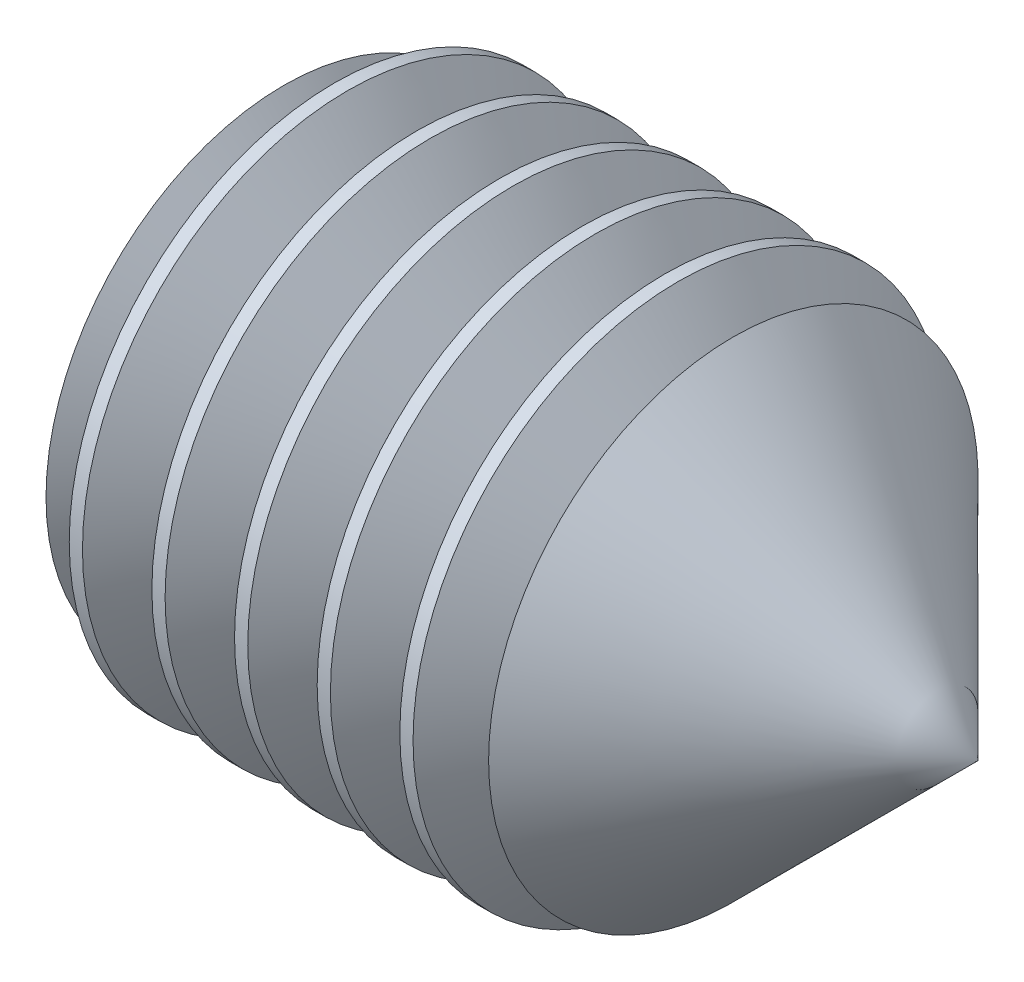
ISO-10303-21;
HEADER;
FILE_DESCRIPTION(('STEP AP214'),'2;1');
FILE_NAME('part.step','',(''),(''),'','','');
FILE_SCHEMA(('AUTOMOTIVE_DESIGN { 1 0 10303 214 1 1 1 1 }'));
ENDSEC;
DATA;
#1=APPLICATION_CONTEXT('core data for automotive mechanical design processes');
#2=APPLICATION_PROTOCOL_DEFINITION('international standard','automotive_design',2000,#1);
#3=PRODUCT_CONTEXT('',#1,'mechanical');
#4=PRODUCT('Part','Part','',(#3));
#5=PRODUCT_RELATED_PRODUCT_CATEGORY('part','',(#4));
#6=PRODUCT_DEFINITION_FORMATION('','',#4);
#7=PRODUCT_DEFINITION_CONTEXT('part definition',#1,'design');
#8=PRODUCT_DEFINITION('design','',#6,#7);
#9=PRODUCT_DEFINITION_SHAPE('','',#8);
#10=(LENGTH_UNIT() NAMED_UNIT(*) SI_UNIT(.MILLI.,.METRE.));
#11=(NAMED_UNIT(*) PLANE_ANGLE_UNIT() SI_UNIT($,.RADIAN.));
#12=(NAMED_UNIT(*) SI_UNIT($,.STERADIAN.) SOLID_ANGLE_UNIT());
#13=UNCERTAINTY_MEASURE_WITH_UNIT(LENGTH_MEASURE(1.E-05),#10,'distance_accuracy_value','');
#14=(GEOMETRIC_REPRESENTATION_CONTEXT(3) GLOBAL_UNCERTAINTY_ASSIGNED_CONTEXT((#13)) GLOBAL_UNIT_ASSIGNED_CONTEXT((#10,
#11,#12)) REPRESENTATION_CONTEXT('',''));
#15=CARTESIAN_POINT('',(0.,0.,0.));
#16=DIRECTION('',(0.,0.,1.));
#17=DIRECTION('',(1.,0.,0.));
#18=AXIS2_PLACEMENT_3D('',#15,#16,#17);
#19=CARTESIAN_POINT('',(0.,0.,0.));
#20=DIRECTION('',(-1.,0.,0.));
#21=DIRECTION('',(0.,0.,1.));
#22=AXIS2_PLACEMENT_3D('',#19,#20,#21);
#23=PLANE('',#22);
#24=CARTESIAN_POINT('',(0.,0.,0.));
#25=DIRECTION('',(-1.,0.,0.));
#26=DIRECTION('',(0.,0.,1.));
#27=AXIS2_PLACEMENT_3D('',#24,#25,#26);
#28=CIRCLE('',#27,1.2195);
#29=CARTESIAN_POINT('',(0.,0.,1.2195));
#30=VERTEX_POINT('',#29);
#31=EDGE_CURVE('E11',#30,#30,#28,.T.);
#32=ORIENTED_EDGE('',*,*,#31,.T.);
#33=EDGE_LOOP('',(#32));
#34=FACE_BOUND('',#33,.T.);
#35=DIRECTION('',(0.,0.,-1.));
#36=VECTOR('',#35,1.);
#37=CARTESIAN_POINT('',(0.,0.750000000000003,0.433012701892216));
#38=LINE('',#37,#36);
#39=CARTESIAN_POINT('',(0.,0.750000000000003,0.433012701892216));
#40=VERTEX_POINT('',#39);
#41=CARTESIAN_POINT('',(0.,0.750000000000003,-0.433012701892223));
#42=VERTEX_POINT('',#41);
#43=EDGE_CURVE('E100',#40,#42,#38,.T.);
#44=ORIENTED_EDGE('',*,*,#43,.F.);
#45=DIRECTION('',(0.,-0.866025403784438,0.500000000000001));
#46=VECTOR('',#45,1.);
#47=CARTESIAN_POINT('',(0.,0.750000000000003,0.433012701892216));
#48=LINE('',#47,#46);
#49=CARTESIAN_POINT('',(0.,0.,0.866025403784436));
#50=VERTEX_POINT('',#49);
#51=EDGE_CURVE('E54',#40,#50,#48,.T.);
#52=ORIENTED_EDGE('',*,*,#51,.T.);
#53=DIRECTION('',(0.,0.866025403784439,0.5));
#54=VECTOR('',#53,1.);
#55=CARTESIAN_POINT('',(0.,-0.749999999999996,0.433012701892216));
#56=LINE('',#55,#54);
#57=CARTESIAN_POINT('',(0.,-0.749999999999996,0.433012701892216));
#58=VERTEX_POINT('',#57);
#59=EDGE_CURVE('E106',#58,#50,#56,.T.);
#60=ORIENTED_EDGE('',*,*,#59,.F.);
#61=DIRECTION('',(0.,0.,-1.));
#62=VECTOR('',#61,1.);
#63=CARTESIAN_POINT('',(0.,-0.749999999999996,0.433012701892216));
#64=LINE('',#63,#62);
#65=CARTESIAN_POINT('',(0.,-0.749999999999996,-0.433012701892222));
#66=VERTEX_POINT('',#65);
#67=EDGE_CURVE('E127',#58,#66,#64,.T.);
#68=ORIENTED_EDGE('',*,*,#67,.T.);
#69=DIRECTION('',(0.,0.866025403784438,-0.500000000000001));
#70=VECTOR('',#69,1.);
#71=CARTESIAN_POINT('',(0.,-0.749999999999996,-0.433012701892222));
#72=LINE('',#71,#70);
#73=CARTESIAN_POINT('',(0.,0.,-0.866025403784442));
#74=VERTEX_POINT('',#73);
#75=EDGE_CURVE('E130',#66,#74,#72,.T.);
#76=ORIENTED_EDGE('',*,*,#75,.T.);
#77=DIRECTION('',(0.,-0.866025403784439,-0.5));
#78=VECTOR('',#77,1.);
#79=CARTESIAN_POINT('',(0.,0.750000000000003,-0.433012701892223));
#80=LINE('',#79,#78);
#81=EDGE_CURVE('E133',#42,#74,#80,.T.);
#82=ORIENTED_EDGE('',*,*,#81,.F.);
#83=EDGE_LOOP('',(#44,#52,#60,#68,#76,#82));
#84=FACE_BOUND('',#83,.T.);
#85=ADVANCED_FACE('F38',(#34,#84),#23,.T.);
#86=CARTESIAN_POINT('',(0.,0.,0.));
#87=DIRECTION('',(1.,0.,0.));
#88=DIRECTION('',(0.,0.,-1.));
#89=AXIS2_PLACEMENT_3D('',#86,#87,#88);
#90=CONICAL_SURFACE('',#89,1.2195,1.0471975511966);
#91=CARTESIAN_POINT('',(0.0731865121550404,0.,0.));
#92=DIRECTION('',(-1.,0.,0.));
#93=DIRECTION('',(0.,-1.,0.));
#94=AXIS2_PLACEMENT_3D('',#91,#92,#93);
#95=CIRCLE('',#94,1.34626275748129);
#96=CARTESIAN_POINT('',(0.0731865121550406,-1.34626275748129,0.));
#97=VERTEX_POINT('',#96);
#98=EDGE_CURVE('E125',#97,#97,#95,.F.);
#99=ORIENTED_EDGE('',*,*,#98,.F.);
#100=EDGE_LOOP('',(#99));
#101=FACE_BOUND('',#100,.T.);
#102=ORIENTED_EDGE('',*,*,#31,.F.);
#103=EDGE_LOOP('',(#102));
#104=FACE_BOUND('',#103,.T.);
#105=ADVANCED_FACE('F221',(#101,#104),#90,.T.);
#106=CARTESIAN_POINT('',(2.,0.750000000000003,0.433012701892216));
#107=DIRECTION('',(0.,-0.500000000000001,-0.866025403784438));
#108=DIRECTION('',(0.,0.866025403784438,-0.500000000000001));
#109=AXIS2_PLACEMENT_3D('',#106,#107,#108);
#110=PLANE('',#109);
#111=ORIENTED_EDGE('',*,*,#51,.F.);
#112=DIRECTION('',(-1.,0.,0.));
#113=VECTOR('',#112,1.);
#114=CARTESIAN_POINT('',(2.,0.750000000000003,0.433012701892216));
#115=LINE('',#114,#113);
#116=CARTESIAN_POINT('',(2.,0.750000000000003,0.433012701892216));
#117=VERTEX_POINT('',#116);
#118=EDGE_CURVE('E94',#117,#40,#115,.T.);
#119=ORIENTED_EDGE('',*,*,#118,.F.);
#120=DIRECTION('',(0.,-0.866025403784438,0.500000000000001));
#121=VECTOR('',#120,1.);
#122=CARTESIAN_POINT('',(2.,0.750000000000003,0.433012701892216));
#123=LINE('',#122,#121);
#124=CARTESIAN_POINT('',(2.,0.,0.866025403784436));
#125=VERTEX_POINT('',#124);
#126=EDGE_CURVE('E90',#117,#125,#123,.T.);
#127=ORIENTED_EDGE('',*,*,#126,.T.);
#128=DIRECTION('',(-1.,0.,0.));
#129=VECTOR('',#128,1.);
#130=CARTESIAN_POINT('',(2.,0.,0.866025403784436));
#131=LINE('',#130,#129);
#132=EDGE_CURVE('E46',#125,#50,#131,.T.);
#133=ORIENTED_EDGE('',*,*,#132,.T.);
#134=EDGE_LOOP('',(#111,#119,#127,#133));
#135=FACE_BOUND('',#134,.T.);
#136=ADVANCED_FACE('F92',(#135),#110,.T.);
#137=CARTESIAN_POINT('',(2.,-0.749999999999996,0.433012701892216));
#138=DIRECTION('',(0.,-0.5,0.866025403784439));
#139=DIRECTION('',(0.,-0.866025403784439,-0.5));
#140=AXIS2_PLACEMENT_3D('',#137,#138,#139);
#141=PLANE('',#140);
#142=ORIENTED_EDGE('',*,*,#59,.T.);
#143=ORIENTED_EDGE('',*,*,#132,.F.);
#144=DIRECTION('',(0.,0.866025403784439,0.5));
#145=VECTOR('',#144,1.);
#146=CARTESIAN_POINT('',(2.,-0.749999999999996,0.433012701892216));
#147=LINE('',#146,#145);
#148=CARTESIAN_POINT('',(2.,-0.749999999999996,0.433012701892216));
#149=VERTEX_POINT('',#148);
#150=EDGE_CURVE('E99',#149,#125,#147,.T.);
#151=ORIENTED_EDGE('',*,*,#150,.F.);
#152=DIRECTION('',(-1.,0.,0.));
#153=VECTOR('',#152,1.);
#154=CARTESIAN_POINT('',(2.,-0.749999999999996,0.433012701892216));
#155=LINE('',#154,#153);
#156=EDGE_CURVE('E107',#149,#58,#155,.T.);
#157=ORIENTED_EDGE('',*,*,#156,.T.);
#158=EDGE_LOOP('',(#142,#143,#151,#157));
#159=FACE_BOUND('',#158,.T.);
#160=ADVANCED_FACE('F104',(#159),#141,.F.);
#161=CARTESIAN_POINT('',(2.,-0.749999999999996,0.433012701892216));
#162=DIRECTION('',(0.,1.,0.));
#163=DIRECTION('',(0.,0.,1.));
#164=AXIS2_PLACEMENT_3D('',#161,#162,#163);
#165=PLANE('',#164);
#166=ORIENTED_EDGE('',*,*,#67,.F.);
#167=ORIENTED_EDGE('',*,*,#156,.F.);
#168=DIRECTION('',(0.,0.,-1.));
#169=VECTOR('',#168,1.);
#170=CARTESIAN_POINT('',(2.,-0.749999999999996,0.433012701892216));
#171=LINE('',#170,#169);
#172=CARTESIAN_POINT('',(2.,-0.749999999999996,-0.433012701892222));
#173=VERTEX_POINT('',#172);
#174=EDGE_CURVE('E112',#149,#173,#171,.T.);
#175=ORIENTED_EDGE('',*,*,#174,.T.);
#176=DIRECTION('',(-1.,0.,0.));
#177=VECTOR('',#176,1.);
#178=CARTESIAN_POINT('',(2.,-0.749999999999996,-0.433012701892222));
#179=LINE('',#178,#177);
#180=EDGE_CURVE('E143',#173,#66,#179,.T.);
#181=ORIENTED_EDGE('',*,*,#180,.T.);
#182=EDGE_LOOP('',(#166,#167,#175,#181));
#183=FACE_BOUND('',#182,.T.);
#184=ADVANCED_FACE('F243',(#183),#165,.T.);
#185=CARTESIAN_POINT('',(2.,-0.749999999999996,-0.433012701892222));
#186=DIRECTION('',(0.,0.500000000000001,0.866025403784438));
#187=DIRECTION('',(0.,-0.866025403784438,0.500000000000001));
#188=AXIS2_PLACEMENT_3D('',#185,#186,#187);
#189=PLANE('',#188);
#190=ORIENTED_EDGE('',*,*,#75,.F.);
#191=ORIENTED_EDGE('',*,*,#180,.F.);
#192=DIRECTION('',(0.,0.866025403784438,-0.500000000000001));
#193=VECTOR('',#192,1.);
#194=CARTESIAN_POINT('',(2.,-0.749999999999996,-0.433012701892222));
#195=LINE('',#194,#193);
#196=CARTESIAN_POINT('',(2.,0.,-0.866025403784442));
#197=VERTEX_POINT('',#196);
#198=EDGE_CURVE('E114',#173,#197,#195,.T.);
#199=ORIENTED_EDGE('',*,*,#198,.T.);
#200=DIRECTION('',(-1.,0.,0.));
#201=VECTOR('',#200,1.);
#202=CARTESIAN_POINT('',(2.,0.,-0.866025403784442));
#203=LINE('',#202,#201);
#204=EDGE_CURVE('E141',#197,#74,#203,.T.);
#205=ORIENTED_EDGE('',*,*,#204,.T.);
#206=EDGE_LOOP('',(#190,#191,#199,#205));
#207=FACE_BOUND('',#206,.T.);
#208=ADVANCED_FACE('F239',(#207),#189,.T.);
#209=CARTESIAN_POINT('',(2.,0.750000000000003,-0.433012701892223));
#210=DIRECTION('',(0.,0.5,-0.866025403784439));
#211=DIRECTION('',(0.,0.866025403784439,0.5));
#212=AXIS2_PLACEMENT_3D('',#209,#210,#211);
#213=PLANE('',#212);
#214=ORIENTED_EDGE('',*,*,#81,.T.);
#215=ORIENTED_EDGE('',*,*,#204,.F.);
#216=DIRECTION('',(0.,-0.866025403784439,-0.5));
#217=VECTOR('',#216,1.);
#218=CARTESIAN_POINT('',(2.,0.750000000000003,-0.433012701892223));
#219=LINE('',#218,#217);
#220=CARTESIAN_POINT('',(2.,0.750000000000003,-0.433012701892223));
#221=VERTEX_POINT('',#220);
#222=EDGE_CURVE('E119',#221,#197,#219,.T.);
#223=ORIENTED_EDGE('',*,*,#222,.F.);
#224=DIRECTION('',(-1.,0.,0.));
#225=VECTOR('',#224,1.);
#226=CARTESIAN_POINT('',(2.,0.750000000000003,-0.433012701892223));
#227=LINE('',#226,#225);
#228=EDGE_CURVE('E139',#221,#42,#227,.T.);
#229=ORIENTED_EDGE('',*,*,#228,.T.);
#230=EDGE_LOOP('',(#214,#215,#223,#229));
#231=FACE_BOUND('',#230,.T.);
#232=ADVANCED_FACE('F236',(#231),#213,.F.);
#233=CARTESIAN_POINT('',(2.,0.750000000000003,0.433012701892216));
#234=DIRECTION('',(0.,1.,0.));
#235=DIRECTION('',(0.,0.,1.));
#236=AXIS2_PLACEMENT_3D('',#233,#234,#235);
#237=PLANE('',#236);
#238=ORIENTED_EDGE('',*,*,#43,.T.);
#239=ORIENTED_EDGE('',*,*,#228,.F.);
#240=DIRECTION('',(0.,0.,-1.));
#241=VECTOR('',#240,1.);
#242=CARTESIAN_POINT('',(2.,0.750000000000003,0.433012701892216));
#243=LINE('',#242,#241);
#244=EDGE_CURVE('E122',#117,#221,#243,.T.);
#245=ORIENTED_EDGE('',*,*,#244,.F.);
#246=ORIENTED_EDGE('',*,*,#118,.T.);
#247=EDGE_LOOP('',(#238,#239,#245,#246));
#248=FACE_BOUND('',#247,.T.);
#249=ADVANCED_FACE('F232',(#248),#237,.F.);
#250=CARTESIAN_POINT('',(2.,1.5,0.));
#251=DIRECTION('',(1.,0.,0.));
#252=DIRECTION('',(0.,0.,-1.));
#253=AXIS2_PLACEMENT_3D('',#250,#251,#252);
#254=PLANE('',#253);
#255=ORIENTED_EDGE('',*,*,#126,.F.);
#256=ORIENTED_EDGE('',*,*,#244,.T.);
#257=ORIENTED_EDGE('',*,*,#222,.T.);
#258=ORIENTED_EDGE('',*,*,#198,.F.);
#259=ORIENTED_EDGE('',*,*,#174,.F.);
#260=ORIENTED_EDGE('',*,*,#150,.T.);
#261=EDGE_LOOP('',(#255,#256,#257,#258,#259,#260));
#262=FACE_BOUND('',#261,.T.);
#263=ADVANCED_FACE('F110',(#262),#254,.F.);
#264=CARTESIAN_POINT('',(0.358354964975511,0.,0.));
#265=DIRECTION('',(1.,0.,0.));
#266=DIRECTION('',(0.,1.,0.));
#267=AXIS2_PLACEMENT_3D('',#264,#265,#266);
#268=CONICAL_SURFACE('',#267,1.5,0.959931088596883);
#269=CARTESIAN_POINT('',(0.161946750507689,0.,0.));
#270=DIRECTION('',(-1.,0.,0.));
#271=DIRECTION('',(0.,-1.,0.));
#272=AXIS2_PLACEMENT_3D('',#269,#270,#271);
#273=CIRCLE('',#272,1.2195);
#274=CARTESIAN_POINT('',(0.161946750507689,-1.2195,0.));
#275=VERTEX_POINT('',#274);
#276=EDGE_CURVE('E150',#275,#275,#273,.T.);
#277=ORIENTED_EDGE('',*,*,#276,.F.);
#278=EDGE_LOOP('',(#277));
#279=FACE_BOUND('',#278,.T.);
#280=CARTESIAN_POINT('',(0.358354964975511,0.,0.));
#281=DIRECTION('',(-1.,0.,0.));
#282=DIRECTION('',(0.,-1.,0.));
#283=AXIS2_PLACEMENT_3D('',#280,#281,#282);
#284=CIRCLE('',#283,1.5);
#285=CARTESIAN_POINT('',(0.358354964975512,-1.5,0.));
#286=VERTEX_POINT('',#285);
#287=EDGE_CURVE('E146',#286,#286,#284,.T.);
#288=ORIENTED_EDGE('',*,*,#287,.T.);
#289=EDGE_LOOP('',(#288));
#290=FACE_BOUND('',#289,.T.);
#291=ADVANCED_FACE('F270',(#279,#290),#268,.T.);
#292=CARTESIAN_POINT('',(0.161946750507689,0.,0.));
#293=DIRECTION('',(-1.,0.,0.));
#294=DIRECTION('',(0.,-1.,0.));
#295=AXIS2_PLACEMENT_3D('',#292,#293,#294);
#296=CONICAL_SURFACE('',#295,1.2195,0.959931088596876);
#297=ORIENTED_EDGE('',*,*,#98,.T.);
#298=EDGE_LOOP('',(#297));
#299=FACE_BOUND('',#298,.T.);
#300=ORIENTED_EDGE('',*,*,#276,.T.);
#301=EDGE_LOOP('',(#300));
#302=FACE_BOUND('',#301,.T.);
#303=ADVANCED_FACE('F260',(#299,#302),#296,.T.);
#304=CARTESIAN_POINT('',(-12.7,0.,0.));
#305=DIRECTION('',(-1.,0.,0.));
#306=DIRECTION('',(0.,0.,1.));
#307=AXIS2_PLACEMENT_3D('',#304,#305,#306);
#308=CYLINDRICAL_SURFACE('',#307,1.5);
#309=CARTESIAN_POINT('',(0.433149376590281,0.,0.));
#310=DIRECTION('',(-1.,0.,0.));
#311=DIRECTION('',(0.,-1.,0.));
#312=AXIS2_PLACEMENT_3D('',#309,#310,#311);
#313=CIRCLE('',#312,1.5);
#314=CARTESIAN_POINT('',(0.433149376590282,-1.5,0.));
#315=VERTEX_POINT('',#314);
#316=EDGE_CURVE('E159',#315,#315,#313,.T.);
#317=ORIENTED_EDGE('',*,*,#316,.T.);
#318=EDGE_LOOP('',(#317));
#319=FACE_BOUND('',#318,.T.);
#320=ORIENTED_EDGE('',*,*,#287,.F.);
#321=EDGE_LOOP('',(#320));
#322=FACE_BOUND('',#321,.T.);
#323=ADVANCED_FACE('F217',(#319,#322),#308,.T.);
#324=CARTESIAN_POINT('',(0.82596580552593,0.,0.));
#325=DIRECTION('',(1.,0.,0.));
#326=DIRECTION('',(0.,1.,0.));
#327=AXIS2_PLACEMENT_3D('',#324,#325,#326);
#328=CONICAL_SURFACE('',#327,1.5,0.959931088596883);
#329=CARTESIAN_POINT('',(0.629557591058107,0.,0.));
#330=DIRECTION('',(-1.,0.,0.));
#331=DIRECTION('',(0.,-1.,0.));
#332=AXIS2_PLACEMENT_3D('',#329,#330,#331);
#333=CIRCLE('',#332,1.2195);
#334=CARTESIAN_POINT('',(0.629557591058107,-1.2195,0.));
#335=VERTEX_POINT('',#334);
#336=EDGE_CURVE('E162',#335,#335,#333,.T.);
#337=ORIENTED_EDGE('',*,*,#336,.F.);
#338=EDGE_LOOP('',(#337));
#339=FACE_BOUND('',#338,.T.);
#340=CARTESIAN_POINT('',(0.82596580552593,0.,0.));
#341=DIRECTION('',(-1.,0.,0.));
#342=DIRECTION('',(0.,-1.,0.));
#343=AXIS2_PLACEMENT_3D('',#340,#341,#342);
#344=CIRCLE('',#343,1.5);
#345=CARTESIAN_POINT('',(0.82596580552593,-1.5,0.));
#346=VERTEX_POINT('',#345);
#347=EDGE_CURVE('E154',#346,#346,#344,.T.);
#348=ORIENTED_EDGE('',*,*,#347,.T.);
#349=EDGE_LOOP('',(#348));
#350=FACE_BOUND('',#349,.T.);
#351=ADVANCED_FACE('F259',(#339,#350),#328,.T.);
#352=CARTESIAN_POINT('',(0.629557591058107,0.,0.));
#353=DIRECTION('',(-1.,0.,0.));
#354=DIRECTION('',(0.,-1.,0.));
#355=AXIS2_PLACEMENT_3D('',#352,#353,#354);
#356=CONICAL_SURFACE('',#355,1.2195,0.959931088596876);
#357=ORIENTED_EDGE('',*,*,#316,.F.);
#358=EDGE_LOOP('',(#357));
#359=FACE_BOUND('',#358,.T.);
#360=ORIENTED_EDGE('',*,*,#336,.T.);
#361=EDGE_LOOP('',(#360));
#362=FACE_BOUND('',#361,.T.);
#363=ADVANCED_FACE('F267',(#359,#362),#356,.T.);
#364=CARTESIAN_POINT('',(0.9007602171407,0.,0.));
#365=DIRECTION('',(-1.,0.,0.));
#366=DIRECTION('',(0.,-1.,0.));
#367=AXIS2_PLACEMENT_3D('',#364,#365,#366);
#368=CIRCLE('',#367,1.5);
#369=CARTESIAN_POINT('',(0.9007602171407,-1.5,0.));
#370=VERTEX_POINT('',#369);
#371=EDGE_CURVE('E168',#370,#370,#368,.T.);
#372=ORIENTED_EDGE('',*,*,#371,.T.);
#373=EDGE_LOOP('',(#372));
#374=FACE_BOUND('',#373,.T.);
#375=ORIENTED_EDGE('',*,*,#347,.F.);
#376=EDGE_LOOP('',(#375));
#377=FACE_BOUND('',#376,.T.);
#378=ADVANCED_FACE('F262',(#374,#377),#308,.T.);
#379=CARTESIAN_POINT('',(1.29357664607635,0.,0.));
#380=DIRECTION('',(1.,0.,0.));
#381=DIRECTION('',(0.,1.,0.));
#382=AXIS2_PLACEMENT_3D('',#379,#380,#381);
#383=CONICAL_SURFACE('',#382,1.5,0.959931088596883);
#384=CARTESIAN_POINT('',(1.09716843160853,0.,0.));
#385=DIRECTION('',(-1.,0.,0.));
#386=DIRECTION('',(0.,-1.,0.));
#387=AXIS2_PLACEMENT_3D('',#384,#385,#386);
#388=CIRCLE('',#387,1.2195);
#389=CARTESIAN_POINT('',(1.09716843160853,-1.2195,0.));
#390=VERTEX_POINT('',#389);
#391=EDGE_CURVE('E171',#390,#390,#388,.T.);
#392=ORIENTED_EDGE('',*,*,#391,.F.);
#393=EDGE_LOOP('',(#392));
#394=FACE_BOUND('',#393,.T.);
#395=CARTESIAN_POINT('',(1.29357664607635,0.,0.));
#396=DIRECTION('',(-1.,0.,0.));
#397=DIRECTION('',(0.,-1.,0.));
#398=AXIS2_PLACEMENT_3D('',#395,#396,#397);
#399=CIRCLE('',#398,1.5);
#400=CARTESIAN_POINT('',(1.29357664607635,-1.5,0.));
#401=VERTEX_POINT('',#400);
#402=EDGE_CURVE('E165',#401,#401,#399,.T.);
#403=ORIENTED_EDGE('',*,*,#402,.T.);
#404=EDGE_LOOP('',(#403));
#405=FACE_BOUND('',#404,.T.);
#406=ADVANCED_FACE('F274',(#394,#405),#383,.T.);
#407=CARTESIAN_POINT('',(1.09716843160853,0.,0.));
#408=DIRECTION('',(-1.,0.,0.));
#409=DIRECTION('',(0.,-1.,0.));
#410=AXIS2_PLACEMENT_3D('',#407,#408,#409);
#411=CONICAL_SURFACE('',#410,1.2195,0.959931088596876);
#412=ORIENTED_EDGE('',*,*,#371,.F.);
#413=EDGE_LOOP('',(#412));
#414=FACE_BOUND('',#413,.T.);
#415=ORIENTED_EDGE('',*,*,#391,.T.);
#416=EDGE_LOOP('',(#415));
#417=FACE_BOUND('',#416,.T.);
#418=ADVANCED_FACE('F281',(#414,#417),#411,.T.);
#419=CARTESIAN_POINT('',(1.36837105769112,0.,0.));
#420=DIRECTION('',(-1.,0.,0.));
#421=DIRECTION('',(0.,-1.,0.));
#422=AXIS2_PLACEMENT_3D('',#419,#420,#421);
#423=CIRCLE('',#422,1.5);
#424=CARTESIAN_POINT('',(1.36837105769112,-1.5,0.));
#425=VERTEX_POINT('',#424);
#426=EDGE_CURVE('E177',#425,#425,#423,.T.);
#427=ORIENTED_EDGE('',*,*,#426,.T.);
#428=EDGE_LOOP('',(#427));
#429=FACE_BOUND('',#428,.T.);
#430=ORIENTED_EDGE('',*,*,#402,.F.);
#431=EDGE_LOOP('',(#430));
#432=FACE_BOUND('',#431,.T.);
#433=ADVANCED_FACE('F276',(#429,#432),#308,.T.);
#434=CARTESIAN_POINT('',(1.76118748662677,0.,0.));
#435=DIRECTION('',(1.,0.,0.));
#436=DIRECTION('',(0.,1.,0.));
#437=AXIS2_PLACEMENT_3D('',#434,#435,#436);
#438=CONICAL_SURFACE('',#437,1.5,0.959931088596883);
#439=CARTESIAN_POINT('',(1.56477927215894,0.,0.));
#440=DIRECTION('',(-1.,0.,0.));
#441=DIRECTION('',(0.,-1.,0.));
#442=AXIS2_PLACEMENT_3D('',#439,#440,#441);
#443=CIRCLE('',#442,1.2195);
#444=CARTESIAN_POINT('',(1.56477927215894,-1.2195,0.));
#445=VERTEX_POINT('',#444);
#446=EDGE_CURVE('E180',#445,#445,#443,.T.);
#447=ORIENTED_EDGE('',*,*,#446,.F.);
#448=EDGE_LOOP('',(#447));
#449=FACE_BOUND('',#448,.T.);
#450=CARTESIAN_POINT('',(1.76118748662677,0.,0.));
#451=DIRECTION('',(-1.,0.,0.));
#452=DIRECTION('',(0.,-1.,0.));
#453=AXIS2_PLACEMENT_3D('',#450,#451,#452);
#454=CIRCLE('',#453,1.5);
#455=CARTESIAN_POINT('',(1.76118748662677,-1.5,0.));
#456=VERTEX_POINT('',#455);
#457=EDGE_CURVE('E174',#456,#456,#454,.T.);
#458=ORIENTED_EDGE('',*,*,#457,.T.);
#459=EDGE_LOOP('',(#458));
#460=FACE_BOUND('',#459,.T.);
#461=ADVANCED_FACE('F288',(#449,#460),#438,.T.);
#462=CARTESIAN_POINT('',(1.56477927215894,0.,0.));
#463=DIRECTION('',(-1.,0.,0.));
#464=DIRECTION('',(0.,-1.,0.));
#465=AXIS2_PLACEMENT_3D('',#462,#463,#464);
#466=CONICAL_SURFACE('',#465,1.2195,0.959931088596876);
#467=ORIENTED_EDGE('',*,*,#426,.F.);
#468=EDGE_LOOP('',(#467));
#469=FACE_BOUND('',#468,.T.);
#470=ORIENTED_EDGE('',*,*,#446,.T.);
#471=EDGE_LOOP('',(#470));
#472=FACE_BOUND('',#471,.T.);
#473=ADVANCED_FACE('F294',(#469,#472),#466,.T.);
#474=CARTESIAN_POINT('',(1.83598189824154,0.,0.));
#475=DIRECTION('',(-1.,0.,0.));
#476=DIRECTION('',(0.,-1.,0.));
#477=AXIS2_PLACEMENT_3D('',#474,#475,#476);
#478=CIRCLE('',#477,1.5);
#479=CARTESIAN_POINT('',(1.83598189824154,-1.5,0.));
#480=VERTEX_POINT('',#479);
#481=EDGE_CURVE('E186',#480,#480,#478,.T.);
#482=ORIENTED_EDGE('',*,*,#481,.T.);
#483=EDGE_LOOP('',(#482));
#484=FACE_BOUND('',#483,.T.);
#485=ORIENTED_EDGE('',*,*,#457,.F.);
#486=EDGE_LOOP('',(#485));
#487=FACE_BOUND('',#486,.T.);
#488=ADVANCED_FACE('F216',(#484,#487),#308,.T.);
#489=CARTESIAN_POINT('',(2.22879832717719,0.,0.));
#490=DIRECTION('',(1.,0.,0.));
#491=DIRECTION('',(0.,1.,0.));
#492=AXIS2_PLACEMENT_3D('',#489,#490,#491);
#493=CONICAL_SURFACE('',#492,1.5,0.959931088596883);
#494=CARTESIAN_POINT('',(2.03239011270936,0.,0.));
#495=DIRECTION('',(-1.,0.,0.));
#496=DIRECTION('',(0.,-1.,0.));
#497=AXIS2_PLACEMENT_3D('',#494,#495,#496);
#498=CIRCLE('',#497,1.2195);
#499=CARTESIAN_POINT('',(2.03239011270936,-1.2195,0.));
#500=VERTEX_POINT('',#499);
#501=EDGE_CURVE('E189',#500,#500,#498,.T.);
#502=ORIENTED_EDGE('',*,*,#501,.F.);
#503=EDGE_LOOP('',(#502));
#504=FACE_BOUND('',#503,.T.);
#505=CARTESIAN_POINT('',(2.22879832717719,0.,0.));
#506=DIRECTION('',(-1.,0.,0.));
#507=DIRECTION('',(0.,-1.,0.));
#508=AXIS2_PLACEMENT_3D('',#505,#506,#507);
#509=CIRCLE('',#508,1.5);
#510=CARTESIAN_POINT('',(2.22879832717719,-1.5,0.));
#511=VERTEX_POINT('',#510);
#512=EDGE_CURVE('E183',#511,#511,#509,.T.);
#513=ORIENTED_EDGE('',*,*,#512,.T.);
#514=EDGE_LOOP('',(#513));
#515=FACE_BOUND('',#514,.T.);
#516=ADVANCED_FACE('F301',(#504,#515),#493,.T.);
#517=CARTESIAN_POINT('',(2.03239011270936,0.,0.));
#518=DIRECTION('',(-1.,0.,0.));
#519=DIRECTION('',(0.,-1.,0.));
#520=AXIS2_PLACEMENT_3D('',#517,#518,#519);
#521=CONICAL_SURFACE('',#520,1.2195,0.959931088596876);
#522=ORIENTED_EDGE('',*,*,#481,.F.);
#523=EDGE_LOOP('',(#522));
#524=FACE_BOUND('',#523,.T.);
#525=ORIENTED_EDGE('',*,*,#501,.T.);
#526=EDGE_LOOP('',(#525));
#527=FACE_BOUND('',#526,.T.);
#528=ADVANCED_FACE('F213',(#524,#527),#521,.T.);
#529=CARTESIAN_POINT('',(2.30359273879196,0.,0.));
#530=DIRECTION('',(-1.,0.,0.));
#531=DIRECTION('',(0.,-1.,0.));
#532=AXIS2_PLACEMENT_3D('',#529,#530,#531);
#533=CIRCLE('',#532,1.5);
#534=CARTESIAN_POINT('',(2.30359273879196,-1.5,0.));
#535=VERTEX_POINT('',#534);
#536=EDGE_CURVE('E192',#535,#535,#533,.T.);
#537=ORIENTED_EDGE('',*,*,#536,.T.);
#538=EDGE_LOOP('',(#537));
#539=FACE_BOUND('',#538,.T.);
#540=ORIENTED_EDGE('',*,*,#512,.F.);
#541=EDGE_LOOP('',(#540));
#542=FACE_BOUND('',#541,.T.);
#543=ADVANCED_FACE('F203',(#539,#542),#308,.T.);
#544=CARTESIAN_POINT('',(2.6964091677276,0.,0.));
#545=DIRECTION('',(1.,0.,0.));
#546=DIRECTION('',(0.,1.,0.));
#547=AXIS2_PLACEMENT_3D('',#544,#545,#546);
#548=CONICAL_SURFACE('',#547,1.5,0.959931088596883);
#549=CARTESIAN_POINT('',(2.61552070162824,0.,0.));
#550=DIRECTION('',(1.,0.,0.));
#551=DIRECTION('',(0.,1.,0.));
#552=AXIS2_PLACEMENT_3D('',#549,#550,#551);
#553=CIRCLE('',#552,1.38447929837177);
#554=CARTESIAN_POINT('',(2.61552070162824,1.38447929837177,0.));
#555=VERTEX_POINT('',#554);
#556=EDGE_CURVE('E41',#555,#555,#553,.F.);
#557=ORIENTED_EDGE('',*,*,#556,.T.);
#558=EDGE_LOOP('',(#557));
#559=FACE_BOUND('',#558,.T.);
#560=CARTESIAN_POINT('',(2.50000095325978,0.,0.));
#561=DIRECTION('',(-1.,0.,0.));
#562=DIRECTION('',(0.,-1.,0.));
#563=AXIS2_PLACEMENT_3D('',#560,#561,#562);
#564=CIRCLE('',#563,1.2195);
#565=CARTESIAN_POINT('',(2.50000095325978,-1.2195,0.));
#566=VERTEX_POINT('',#565);
#567=EDGE_CURVE('E195',#566,#566,#564,.T.);
#568=ORIENTED_EDGE('',*,*,#567,.F.);
#569=EDGE_LOOP('',(#568));
#570=FACE_BOUND('',#569,.T.);
#571=ADVANCED_FACE('F201',(#559,#570),#548,.T.);
#572=CARTESIAN_POINT('',(2.50000095325978,0.,0.));
#573=DIRECTION('',(-1.,0.,0.));
#574=DIRECTION('',(0.,-1.,0.));
#575=AXIS2_PLACEMENT_3D('',#572,#573,#574);
#576=CONICAL_SURFACE('',#575,1.2195,0.959931088596876);
#577=ORIENTED_EDGE('',*,*,#536,.F.);
#578=EDGE_LOOP('',(#577));
#579=FACE_BOUND('',#578,.T.);
#580=ORIENTED_EDGE('',*,*,#567,.T.);
#581=EDGE_LOOP('',(#580));
#582=FACE_BOUND('',#581,.T.);
#583=ADVANCED_FACE('F199',(#579,#582),#576,.T.);
#584=CARTESIAN_POINT('',(2.50000000000001,0.,0.));
#585=DIRECTION('',(-1.,0.,0.));
#586=DIRECTION('',(0.,0.,1.));
#587=AXIS2_PLACEMENT_3D('',#584,#585,#586);
#588=CONICAL_SURFACE('',#587,1.5,0.78539816339745);
#589=ORIENTED_EDGE('',*,*,#556,.F.);
#590=EDGE_LOOP('',(#589));
#591=FACE_BOUND('',#590,.T.);
#592=CARTESIAN_POINT('',(4.,0.,0.));
#593=VERTEX_POINT('',#592);
#594=VERTEX_LOOP('',#593);
#595=FACE_BOUND('',#594,.T.);
#596=ADVANCED_FACE('F210',(#591,#595),#588,.T.);
#597=CLOSED_SHELL('',(#85,#105,#136,#160,#184,#208,#232,#249,#263,#291,#303,#323,#351,#363,#378,
#406,#418,#433,#461,#473,#488,#516,#528,#543,#571,#583,#596));
#598=MANIFOLD_SOLID_BREP('B2',#597);
#599=ADVANCED_BREP_SHAPE_REPRESENTATION('',(#18,#598),#14);
#600=SHAPE_DEFINITION_REPRESENTATION(#9,#599);
ENDSEC;
END-ISO-10303-21;
